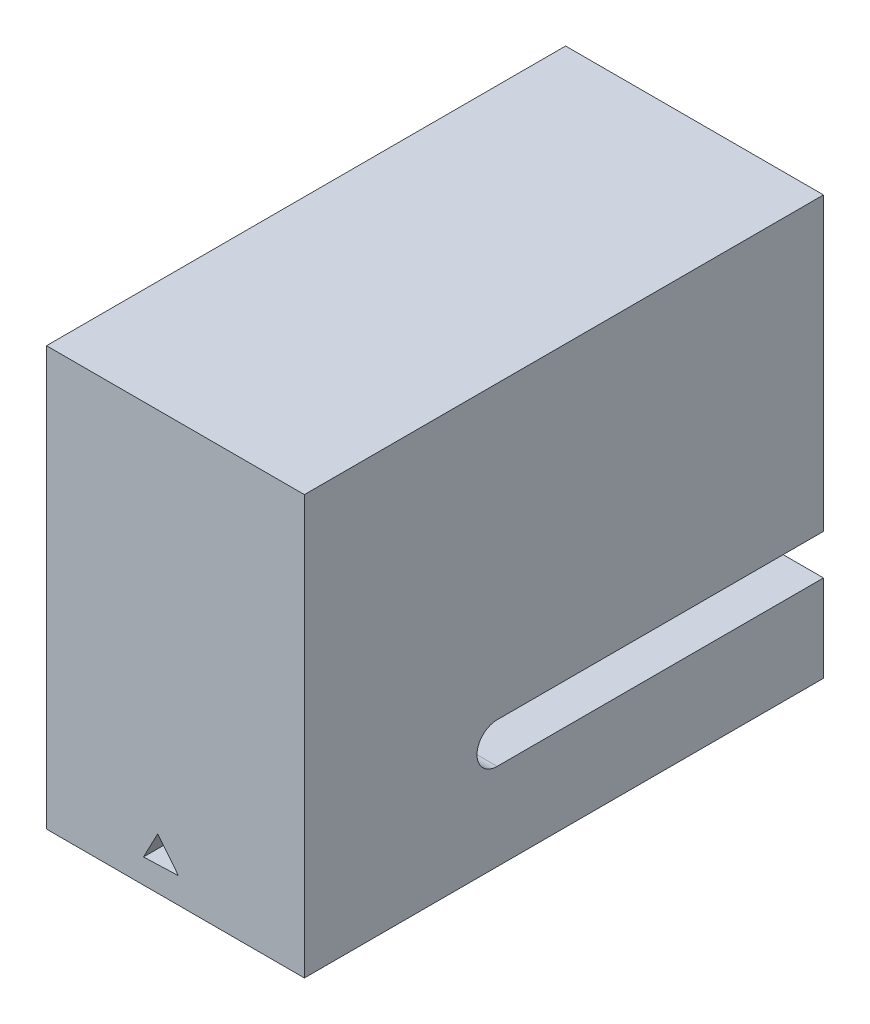
ISO-10303-21;
HEADER;
FILE_DESCRIPTION(('STEP AP214'),'2;1');
FILE_NAME('part.step','',(''),(''),'','','');
FILE_SCHEMA(('AUTOMOTIVE_DESIGN { 1 0 10303 214 1 1 1 1 }'));
ENDSEC;
DATA;
#1=APPLICATION_CONTEXT('core data for automotive mechanical design processes');
#2=APPLICATION_PROTOCOL_DEFINITION('international standard','automotive_design',2000,#1);
#3=PRODUCT_CONTEXT('',#1,'mechanical');
#4=PRODUCT('Part','Part','',(#3));
#5=PRODUCT_RELATED_PRODUCT_CATEGORY('part','',(#4));
#6=PRODUCT_DEFINITION_FORMATION('','',#4);
#7=PRODUCT_DEFINITION_CONTEXT('part definition',#1,'design');
#8=PRODUCT_DEFINITION('design','',#6,#7);
#9=PRODUCT_DEFINITION_SHAPE('','',#8);
#10=(LENGTH_UNIT() NAMED_UNIT(*) SI_UNIT(.MILLI.,.METRE.));
#11=(NAMED_UNIT(*) PLANE_ANGLE_UNIT() SI_UNIT($,.RADIAN.));
#12=(NAMED_UNIT(*) SI_UNIT($,.STERADIAN.) SOLID_ANGLE_UNIT());
#13=UNCERTAINTY_MEASURE_WITH_UNIT(LENGTH_MEASURE(1.E-05),#10,'distance_accuracy_value','');
#14=(GEOMETRIC_REPRESENTATION_CONTEXT(3) GLOBAL_UNCERTAINTY_ASSIGNED_CONTEXT((#13)) GLOBAL_UNIT_ASSIGNED_CONTEXT((#10,
#11,#12)) REPRESENTATION_CONTEXT('',''));
#15=CARTESIAN_POINT('',(0.,0.,0.));
#16=DIRECTION('',(0.,0.,1.));
#17=DIRECTION('',(1.,0.,0.));
#18=AXIS2_PLACEMENT_3D('',#15,#16,#17);
#19=CARTESIAN_POINT('',(0.,0.,0.));
#20=DIRECTION('',(0.,0.,1.));
#21=DIRECTION('',(1.,0.,0.));
#22=AXIS2_PLACEMENT_3D('',#19,#20,#21);
#23=PLANE('',#22);
#24=DIRECTION('',(0.463549599739793,0.886070972654605,0.));
#25=VECTOR('',#24,1.);
#26=CARTESIAN_POINT('',(12.950642546668,3.253694745465,0.));
#27=LINE('',#26,#25);
#28=CARTESIAN_POINT('',(12.950642546668,3.253694745465,0.));
#29=VERTEX_POINT('',#28);
#30=CARTESIAN_POINT('',(14.902719031226,6.985071733687,0.));
#31=VERTEX_POINT('',#30);
#32=EDGE_CURVE('E9',#29,#31,#27,.T.);
#33=ORIENTED_EDGE('',*,*,#32,.F.);
#34=DIRECTION('',(-0.999375523416613,-0.0353350137366763,0.));
#35=VECTOR('',#34,1.);
#36=CARTESIAN_POINT('',(17.619948476348,3.418787831398,0.));
#37=LINE('',#36,#35);
#38=CARTESIAN_POINT('',(17.781301141889,3.424492792666,0.));
#39=VERTEX_POINT('',#38);
#40=EDGE_CURVE('E364',#39,#29,#37,.T.);
#41=ORIENTED_EDGE('',*,*,#40,.F.);
#42=DIRECTION('',(0.62869786887579,-0.777649657410739,0.));
#43=VECTOR('',#42,1.);
#44=CARTESIAN_POINT('',(14.93788161533,6.941578391597,0.));
#45=LINE('',#44,#43);
#46=EDGE_CURVE('E228',#31,#39,#45,.T.);
#47=ORIENTED_EDGE('',*,*,#46,.F.);
#48=EDGE_LOOP('',(#33,#41,#47));
#49=FACE_BOUND('',#48,.T.);
#50=CARTESIAN_POINT('',(5.733123732353,23.306785491,0.));
#51=DIRECTION('',(0.,0.,-1.));
#52=DIRECTION('',(-1.,0.,0.));
#53=AXIS2_PLACEMENT_3D('',#50,#51,#52);
#54=CIRCLE('',#53,1.917016546578);
#55=CARTESIAN_POINT('',(3.816107185775,23.306785491,0.));
#56=VERTEX_POINT('',#55);
#57=EDGE_CURVE('E312',#56,#56,#54,.T.);
#58=ORIENTED_EDGE('',*,*,#57,.F.);
#59=EDGE_LOOP('',(#58));
#60=FACE_BOUND('',#59,.T.);
#61=CARTESIAN_POINT('',(17.704709703638,40.253983811882,0.));
#62=DIRECTION('',(0.,0.,-1.));
#63=DIRECTION('',(-1.,0.,0.));
#64=AXIS2_PLACEMENT_3D('',#61,#62,#63);
#65=CIRCLE('',#64,10.765620622642);
#66=CARTESIAN_POINT('',(28.47033032628,40.253983811882,0.));
#67=VERTEX_POINT('',#66);
#68=CARTESIAN_POINT('',(6.939089080996,40.253983811882,0.));
#69=VERTEX_POINT('',#68);
#70=EDGE_CURVE('E299',#67,#69,#65,.T.);
#71=ORIENTED_EDGE('',*,*,#70,.F.);
#72=DIRECTION('',(0.,-1.,0.));
#73=VECTOR('',#72,1.);
#74=CARTESIAN_POINT('',(28.47033032628,42.092468070347,0.));
#75=LINE('',#74,#73);
#76=CARTESIAN_POINT('',(28.47033032628,42.092468070347,0.));
#77=VERTEX_POINT('',#76);
#78=EDGE_CURVE('E286',#77,#67,#75,.T.);
#79=ORIENTED_EDGE('',*,*,#78,.F.);
#80=CARTESIAN_POINT('',(17.704709703638,42.092468070347,0.));
#81=DIRECTION('',(0.,0.,-1.));
#82=DIRECTION('',(-1.,0.,0.));
#83=AXIS2_PLACEMENT_3D('',#80,#81,#82);
#84=CIRCLE('',#83,10.765620622642);
#85=CARTESIAN_POINT('',(6.939089080996,42.092468070347,0.));
#86=VERTEX_POINT('',#85);
#87=EDGE_CURVE('E282',#86,#77,#84,.T.);
#88=ORIENTED_EDGE('',*,*,#87,.F.);
#89=DIRECTION('',(0.,1.,0.));
#90=VECTOR('',#89,1.);
#91=CARTESIAN_POINT('',(6.939089080996,40.253983811882,0.));
#92=LINE('',#91,#90);
#93=EDGE_CURVE('E298',#69,#86,#92,.T.);
#94=ORIENTED_EDGE('',*,*,#93,.F.);
#95=EDGE_LOOP('',(#71,#79,#88,#94));
#96=FACE_BOUND('',#95,.T.);
#97=DIRECTION('',(0.,1.,0.));
#98=VECTOR('',#97,1.);
#99=CARTESIAN_POINT('',(34.428750430687,0.,0.));
#100=LINE('',#99,#98);
#101=CARTESIAN_POINT('',(34.428750430687,16.986584154754,0.));
#102=VERTEX_POINT('',#101);
#103=CARTESIAN_POINT('',(34.428750430687,55.88417687439,0.));
#104=VERTEX_POINT('',#103);
#105=EDGE_CURVE('E290',#102,#104,#100,.T.);
#106=ORIENTED_EDGE('',*,*,#105,.F.);
#107=DIRECTION('',(-1.,0.,0.));
#108=VECTOR('',#107,1.);
#109=CARTESIAN_POINT('',(34.428750430687,16.986584154754,0.));
#110=LINE('',#109,#108);
#111=CARTESIAN_POINT('',(2.431232507017,16.986584154754,0.));
#112=VERTEX_POINT('',#111);
#113=EDGE_CURVE('E345',#102,#112,#110,.T.);
#114=ORIENTED_EDGE('',*,*,#113,.T.);
#115=DIRECTION('',(0.,1.,0.));
#116=VECTOR('',#115,1.);
#117=CARTESIAN_POINT('',(2.431232507017,11.602100128615,0.));
#118=LINE('',#117,#116);
#119=CARTESIAN_POINT('',(2.431232507017,11.602100128615,0.));
#120=VERTEX_POINT('',#119);
#121=EDGE_CURVE('E268',#120,#112,#118,.T.);
#122=ORIENTED_EDGE('',*,*,#121,.F.);
#123=DIRECTION('',(-1.,0.,0.));
#124=VECTOR('',#123,1.);
#125=CARTESIAN_POINT('',(34.428750430687,11.602100128615,0.));
#126=LINE('',#125,#124);
#127=CARTESIAN_POINT('',(34.428750430687,11.602100128615,0.));
#128=VERTEX_POINT('',#127);
#129=EDGE_CURVE('E269',#128,#120,#126,.T.);
#130=ORIENTED_EDGE('',*,*,#129,.F.);
#131=DIRECTION('',(0.,1.,0.));
#132=VECTOR('',#131,1.);
#133=CARTESIAN_POINT('',(34.428750430687,0.,0.));
#134=LINE('',#133,#132);
#135=CARTESIAN_POINT('',(34.428750430687,0.,0.));
#136=VERTEX_POINT('',#135);
#137=EDGE_CURVE('E287',#136,#128,#134,.T.);
#138=ORIENTED_EDGE('',*,*,#137,.F.);
#139=DIRECTION('',(1.,0.,0.));
#140=VECTOR('',#139,1.);
#141=CARTESIAN_POINT('',(0.,0.,0.));
#142=LINE('',#141,#140);
#143=CARTESIAN_POINT('',(0.,0.,0.));
#144=VERTEX_POINT('',#143);
#145=EDGE_CURVE('E338',#144,#136,#142,.T.);
#146=ORIENTED_EDGE('',*,*,#145,.F.);
#147=DIRECTION('',(0.,1.,0.));
#148=VECTOR('',#147,1.);
#149=CARTESIAN_POINT('',(0.,0.,0.));
#150=LINE('',#149,#148);
#151=CARTESIAN_POINT('',(0.,55.88417687439,0.));
#152=VERTEX_POINT('',#151);
#153=EDGE_CURVE('E291',#144,#152,#150,.T.);
#154=ORIENTED_EDGE('',*,*,#153,.T.);
#155=DIRECTION('',(1.,0.,0.));
#156=VECTOR('',#155,1.);
#157=CARTESIAN_POINT('',(0.,55.88417687439,0.));
#158=LINE('',#157,#156);
#159=EDGE_CURVE('E356',#152,#104,#158,.T.);
#160=ORIENTED_EDGE('',*,*,#159,.T.);
#161=EDGE_LOOP('',(#106,#114,#122,#130,#138,#146,#154,#160));
#162=FACE_BOUND('',#161,.T.);
#163=ADVANCED_FACE('F15',(#49,#60,#96,#162),#23,.F.);
#164=CARTESIAN_POINT('',(12.950642546668,3.253694745465,0.));
#165=DIRECTION('',(-0.886070972654605,0.463549599739793,0.));
#166=DIRECTION('',(0.,0.,1.));
#167=AXIS2_PLACEMENT_3D('',#164,#165,#166);
#168=PLANE('',#167);
#169=DIRECTION('',(0.463549599739793,0.886070972654605,0.));
#170=VECTOR('',#169,1.);
#171=CARTESIAN_POINT('',(12.950642546668,3.253694745465,69.297958036549));
#172=LINE('',#171,#170);
#173=CARTESIAN_POINT('',(12.950642546668,3.253694745465,69.297958036549));
#174=VERTEX_POINT('',#173);
#175=CARTESIAN_POINT('',(14.837516173704,6.860437046445,69.297958036549));
#176=VERTEX_POINT('',#175);
#177=EDGE_CURVE('E253',#174,#176,#172,.T.);
#178=ORIENTED_EDGE('',*,*,#177,.F.);
#179=DIRECTION('',(0.,0.,1.));
#180=VECTOR('',#179,1.);
#181=CARTESIAN_POINT('',(12.950642546668,3.253694745465,0.));
#182=LINE('',#181,#180);
#183=EDGE_CURVE('E371',#29,#174,#182,.T.);
#184=ORIENTED_EDGE('',*,*,#183,.F.);
#185=ORIENTED_EDGE('',*,*,#32,.T.);
#186=CARTESIAN_POINT('',(14.902719031226,6.985071733687,0.));
#187=CARTESIAN_POINT('',(14.864524081595,6.91206242424298,0.));
#188=CARTESIAN_POINT('',(14.8375161737038,6.86043704644537,0.0534594553201564));
#189=CARTESIAN_POINT('',(14.837516173704,6.860437046445,0.129062542071));
#190=(BOUNDED_CURVE() B_SPLINE_CURVE(3,(#186,#187,#188,#189),.UNSPECIFIED.,.F.,
.F.) B_SPLINE_CURVE_WITH_KNOTS((4,4),(4.71238898038469,6.28318530717959),
.UNSPECIFIED.) CURVE() GEOMETRIC_REPRESENTATION_ITEM() RATIONAL_B_SPLINE_CURVE((1.,
0.804737854124365,0.804737854124365,1.)) REPRESENTATION_ITEM(''));
#191=CARTESIAN_POINT('',(14.837516173704,6.860437046445,0.129062542071));
#192=VERTEX_POINT('',#191);
#193=EDGE_CURVE('E24',#31,#192,#190,.T.);
#194=ORIENTED_EDGE('',*,*,#193,.T.);
#195=DIRECTION('',(0.,0.,1.));
#196=VECTOR('',#195,1.);
#197=CARTESIAN_POINT('',(14.837516173704,6.860437046445,0.));
#198=LINE('',#197,#196);
#199=EDGE_CURVE('E278',#192,#176,#198,.T.);
#200=ORIENTED_EDGE('',*,*,#199,.T.);
#201=EDGE_LOOP('',(#178,#184,#185,#194,#200));
#202=FACE_BOUND('',#201,.T.);
#203=ADVANCED_FACE('F17',(#202),#168,.F.);
#204=CARTESIAN_POINT('',(14.93788161533,6.941578391597,0.129062542071));
#205=DIRECTION('',(0.62869786887579,-0.777649657410739,0.));
#206=DIRECTION('',(0.,0.,-1.));
#207=AXIS2_PLACEMENT_3D('',#204,#205,#206);
#208=CYLINDRICAL_SURFACE('',#207,0.129062542071);
#209=ORIENTED_EDGE('',*,*,#46,.T.);
#210=CARTESIAN_POINT('',(17.781301141889,3.424492792666,0.));
#211=CARTESIAN_POINT('',(17.6867829387404,3.42115090372799,0.));
#212=CARTESIAN_POINT('',(17.6199484763485,3.41878783139795,0.0534594553201563));
#213=CARTESIAN_POINT('',(17.619948476348,3.418787831398,0.129062542071));
#214=(BOUNDED_CURVE() B_SPLINE_CURVE(3,(#210,#211,#212,#213),.UNSPECIFIED.,.F.,
.F.) B_SPLINE_CURVE_WITH_KNOTS((4,4),(1.5707963267949,3.1415926535898),
.UNSPECIFIED.) CURVE() GEOMETRIC_REPRESENTATION_ITEM() RATIONAL_B_SPLINE_CURVE((1.,
0.804737854124365,0.804737854124365,1.)) REPRESENTATION_ITEM(''));
#215=CARTESIAN_POINT('',(17.619948476348,3.418787831398,0.129062542071));
#216=VERTEX_POINT('',#215);
#217=EDGE_CURVE('E359',#39,#216,#214,.T.);
#218=ORIENTED_EDGE('',*,*,#217,.T.);
#219=DIRECTION('',(0.62869786887579,-0.777649657410739,0.));
#220=VECTOR('',#219,1.);
#221=CARTESIAN_POINT('',(14.837516173704,6.860437046445,0.129062542071));
#222=LINE('',#221,#220);
#223=EDGE_CURVE('E254',#192,#216,#222,.T.);
#224=ORIENTED_EDGE('',*,*,#223,.F.);
#225=ORIENTED_EDGE('',*,*,#193,.F.);
#226=EDGE_LOOP('',(#209,#218,#224,#225));
#227=FACE_BOUND('',#226,.T.);
#228=ADVANCED_FACE('F377',(#227),#208,.T.);
#229=CARTESIAN_POINT('',(17.619948476348,3.418787831398,0.));
#230=DIRECTION('',(0.0353350137366763,-0.999375523416613,0.));
#231=DIRECTION('',(0.,0.,-1.));
#232=AXIS2_PLACEMENT_3D('',#229,#230,#231);
#233=PLANE('',#232);
#234=ORIENTED_EDGE('',*,*,#217,.F.);
#235=ORIENTED_EDGE('',*,*,#40,.T.);
#236=ORIENTED_EDGE('',*,*,#183,.T.);
#237=DIRECTION('',(-0.999375523416613,-0.0353350137366763,0.));
#238=VECTOR('',#237,1.);
#239=CARTESIAN_POINT('',(17.619948476348,3.418787831398,69.297958036549));
#240=LINE('',#239,#238);
#241=CARTESIAN_POINT('',(17.619948476348,3.418787831398,69.297958036549));
#242=VERTEX_POINT('',#241);
#243=EDGE_CURVE('E259',#242,#174,#240,.T.);
#244=ORIENTED_EDGE('',*,*,#243,.F.);
#245=DIRECTION('',(0.,0.,1.));
#246=VECTOR('',#245,1.);
#247=CARTESIAN_POINT('',(17.619948476348,3.418787831398,0.));
#248=LINE('',#247,#246);
#249=EDGE_CURVE('E258',#216,#242,#248,.T.);
#250=ORIENTED_EDGE('',*,*,#249,.F.);
#251=EDGE_LOOP('',(#234,#235,#236,#244,#250));
#252=FACE_BOUND('',#251,.T.);
#253=ADVANCED_FACE('F383',(#252),#233,.F.);
#254=CARTESIAN_POINT('',(0.,55.88417687439,0.));
#255=DIRECTION('',(0.,1.,0.));
#256=DIRECTION('',(1.,0.,0.));
#257=AXIS2_PLACEMENT_3D('',#254,#255,#256);
#258=PLANE('',#257);
#259=ORIENTED_EDGE('',*,*,#159,.F.);
#260=DIRECTION('',(0.,0.,1.));
#261=VECTOR('',#260,1.);
#262=CARTESIAN_POINT('',(0.,55.88417687439,0.));
#263=LINE('',#262,#261);
#264=CARTESIAN_POINT('',(0.,55.88417687439,69.297958036549));
#265=VERTEX_POINT('',#264);
#266=EDGE_CURVE('E322',#152,#265,#263,.T.);
#267=ORIENTED_EDGE('',*,*,#266,.T.);
#268=DIRECTION('',(1.,0.,0.));
#269=VECTOR('',#268,1.);
#270=CARTESIAN_POINT('',(0.,55.88417687439,69.297958036549));
#271=LINE('',#270,#269);
#272=CARTESIAN_POINT('',(34.428750430687,55.88417687439,69.297958036549));
#273=VERTEX_POINT('',#272);
#274=EDGE_CURVE('E218',#265,#273,#271,.T.);
#275=ORIENTED_EDGE('',*,*,#274,.T.);
#276=DIRECTION('',(0.,0.,1.));
#277=VECTOR('',#276,1.);
#278=CARTESIAN_POINT('',(34.428750430687,55.88417687439,0.));
#279=LINE('',#278,#277);
#280=EDGE_CURVE('E353',#104,#273,#279,.T.);
#281=ORIENTED_EDGE('',*,*,#280,.F.);
#282=EDGE_LOOP('',(#259,#267,#275,#281));
#283=FACE_BOUND('',#282,.T.);
#284=ADVANCED_FACE('F413',(#283),#258,.T.);
#285=CARTESIAN_POINT('',(34.428750430687,0.,0.));
#286=DIRECTION('',(1.,0.,0.));
#287=DIRECTION('',(0.,1.,0.));
#288=AXIS2_PLACEMENT_3D('',#285,#286,#287);
#289=PLANE('',#288);
#290=DIRECTION('',(0.,1.,0.));
#291=VECTOR('',#290,1.);
#292=CARTESIAN_POINT('',(34.428750430687,0.,69.297958036549));
#293=LINE('',#292,#291);
#294=CARTESIAN_POINT('',(34.428750430687,0.,69.297958036549));
#295=VERTEX_POINT('',#294);
#296=EDGE_CURVE('E214',#295,#273,#293,.T.);
#297=ORIENTED_EDGE('',*,*,#296,.F.);
#298=DIRECTION('',(0.,0.,1.));
#299=VECTOR('',#298,1.);
#300=CARTESIAN_POINT('',(34.428750430687,0.,0.));
#301=LINE('',#300,#299);
#302=EDGE_CURVE('E332',#136,#295,#301,.T.);
#303=ORIENTED_EDGE('',*,*,#302,.F.);
#304=ORIENTED_EDGE('',*,*,#137,.T.);
#305=DIRECTION('',(0.,0.,-1.));
#306=VECTOR('',#305,1.);
#307=CARTESIAN_POINT('',(34.428750430687,11.602100128615,43.565455210682));
#308=LINE('',#307,#306);
#309=CARTESIAN_POINT('',(34.428750430687,11.602100128615,43.565455210682));
#310=VERTEX_POINT('',#309);
#311=EDGE_CURVE('E315',#310,#128,#308,.T.);
#312=ORIENTED_EDGE('',*,*,#311,.F.);
#313=CARTESIAN_POINT('',(34.428750430687,14.294342141684,43.565455210682));
#314=DIRECTION('',(1.,0.,0.));
#315=DIRECTION('',(0.,0.,1.));
#316=AXIS2_PLACEMENT_3D('',#313,#314,#315);
#317=CIRCLE('',#316,2.692242013069);
#318=CARTESIAN_POINT('',(34.428750430687,16.986584154754,43.565455210682));
#319=VERTEX_POINT('',#318);
#320=EDGE_CURVE('E205',#319,#310,#317,.T.);
#321=ORIENTED_EDGE('',*,*,#320,.F.);
#322=DIRECTION('',(0.,0.,1.));
#323=VECTOR('',#322,1.);
#324=CARTESIAN_POINT('',(34.428750430687,16.986584154754,0.));
#325=LINE('',#324,#323);
#326=EDGE_CURVE('E342',#102,#319,#325,.T.);
#327=ORIENTED_EDGE('',*,*,#326,.F.);
#328=ORIENTED_EDGE('',*,*,#105,.T.);
#329=ORIENTED_EDGE('',*,*,#280,.T.);
#330=EDGE_LOOP('',(#297,#303,#304,#312,#321,#327,#328,#329));
#331=FACE_BOUND('',#330,.T.);
#332=ADVANCED_FACE('F409',(#331),#289,.T.);
#333=CARTESIAN_POINT('',(0.,0.,0.));
#334=DIRECTION('',(1.,0.,0.));
#335=DIRECTION('',(0.,1.,0.));
#336=AXIS2_PLACEMENT_3D('',#333,#334,#335);
#337=PLANE('',#336);
#338=DIRECTION('',(0.,1.,0.));
#339=VECTOR('',#338,1.);
#340=CARTESIAN_POINT('',(0.,0.,69.297958036549));
#341=LINE('',#340,#339);
#342=CARTESIAN_POINT('',(0.,0.,69.297958036549));
#343=VERTEX_POINT('',#342);
#344=EDGE_CURVE('E198',#343,#265,#341,.T.);
#345=ORIENTED_EDGE('',*,*,#344,.T.);
#346=ORIENTED_EDGE('',*,*,#266,.F.);
#347=ORIENTED_EDGE('',*,*,#153,.F.);
#348=DIRECTION('',(0.,0.,1.));
#349=VECTOR('',#348,1.);
#350=CARTESIAN_POINT('',(0.,0.,0.));
#351=LINE('',#350,#349);
#352=EDGE_CURVE('E335',#144,#343,#351,.T.);
#353=ORIENTED_EDGE('',*,*,#352,.T.);
#354=EDGE_LOOP('',(#345,#346,#347,#353));
#355=FACE_BOUND('',#354,.T.);
#356=ADVANCED_FACE('F401',(#355),#337,.F.);
#357=CARTESIAN_POINT('',(34.428750430687,16.986584154754,0.));
#358=DIRECTION('',(0.,1.,0.));
#359=DIRECTION('',(1.,0.,0.));
#360=AXIS2_PLACEMENT_3D('',#357,#358,#359);
#361=PLANE('',#360);
#362=ORIENTED_EDGE('',*,*,#326,.T.);
#363=DIRECTION('',(-1.,0.,0.));
#364=VECTOR('',#363,1.);
#365=CARTESIAN_POINT('',(34.428750430687,16.986584154754,43.565455210682));
#366=LINE('',#365,#364);
#367=CARTESIAN_POINT('',(2.431232507017,16.986584154754,43.565455210682));
#368=VERTEX_POINT('',#367);
#369=EDGE_CURVE('E195',#319,#368,#366,.T.);
#370=ORIENTED_EDGE('',*,*,#369,.T.);
#371=DIRECTION('',(0.,0.,1.));
#372=VECTOR('',#371,1.);
#373=CARTESIAN_POINT('',(2.431232507017,16.986584154754,0.));
#374=LINE('',#373,#372);
#375=EDGE_CURVE('E329',#112,#368,#374,.T.);
#376=ORIENTED_EDGE('',*,*,#375,.F.);
#377=ORIENTED_EDGE('',*,*,#113,.F.);
#378=EDGE_LOOP('',(#362,#370,#376,#377));
#379=FACE_BOUND('',#378,.T.);
#380=ADVANCED_FACE('F425',(#379),#361,.F.);
#381=CARTESIAN_POINT('',(0.,0.,0.));
#382=DIRECTION('',(0.,1.,0.));
#383=DIRECTION('',(1.,0.,0.));
#384=AXIS2_PLACEMENT_3D('',#381,#382,#383);
#385=PLANE('',#384);
#386=ORIENTED_EDGE('',*,*,#302,.T.);
#387=DIRECTION('',(1.,0.,0.));
#388=VECTOR('',#387,1.);
#389=CARTESIAN_POINT('',(0.,0.,69.297958036549));
#390=LINE('',#389,#388);
#391=EDGE_CURVE('E219',#343,#295,#390,.T.);
#392=ORIENTED_EDGE('',*,*,#391,.F.);
#393=ORIENTED_EDGE('',*,*,#352,.F.);
#394=ORIENTED_EDGE('',*,*,#145,.T.);
#395=EDGE_LOOP('',(#386,#392,#393,#394));
#396=FACE_BOUND('',#395,.T.);
#397=ADVANCED_FACE('F405',(#396),#385,.F.);
#398=CARTESIAN_POINT('',(2.431232507017,14.294342141684,22.490522288247));
#399=DIRECTION('',(1.,0.,0.));
#400=DIRECTION('',(0.,-1.,0.));
#401=AXIS2_PLACEMENT_3D('',#398,#399,#400);
#402=PLANE('',#401);
#403=ORIENTED_EDGE('',*,*,#121,.T.);
#404=ORIENTED_EDGE('',*,*,#375,.T.);
#405=CARTESIAN_POINT('',(2.431232507017,14.294342141684,43.565455210682));
#406=DIRECTION('',(1.,0.,0.));
#407=DIRECTION('',(0.,0.,1.));
#408=AXIS2_PLACEMENT_3D('',#405,#406,#407);
#409=CIRCLE('',#408,2.692242013069);
#410=CARTESIAN_POINT('',(2.431232507017,11.602100128615,43.565455210682));
#411=VERTEX_POINT('',#410);
#412=EDGE_CURVE('E199',#368,#411,#409,.T.);
#413=ORIENTED_EDGE('',*,*,#412,.T.);
#414=DIRECTION('',(0.,0.,-1.));
#415=VECTOR('',#414,1.);
#416=CARTESIAN_POINT('',(2.431232507017,11.602100128615,43.565455210682));
#417=LINE('',#416,#415);
#418=EDGE_CURVE('E264',#411,#120,#417,.T.);
#419=ORIENTED_EDGE('',*,*,#418,.T.);
#420=EDGE_LOOP('',(#403,#404,#413,#419));
#421=FACE_BOUND('',#420,.T.);
#422=ADVANCED_FACE('F428',(#421),#402,.T.);
#423=CARTESIAN_POINT('',(34.428750430687,11.602100128615,43.565455210682));
#424=DIRECTION('',(0.,-1.,0.));
#425=DIRECTION('',(0.,0.,-1.));
#426=AXIS2_PLACEMENT_3D('',#423,#424,#425);
#427=PLANE('',#426);
#428=ORIENTED_EDGE('',*,*,#311,.T.);
#429=ORIENTED_EDGE('',*,*,#129,.T.);
#430=ORIENTED_EDGE('',*,*,#418,.F.);
#431=DIRECTION('',(-1.,0.,0.));
#432=VECTOR('',#431,1.);
#433=CARTESIAN_POINT('',(34.428750430687,11.602100128615,43.565455210682));
#434=LINE('',#433,#432);
#435=EDGE_CURVE('E201',#310,#411,#434,.T.);
#436=ORIENTED_EDGE('',*,*,#435,.F.);
#437=EDGE_LOOP('',(#428,#429,#430,#436));
#438=FACE_BOUND('',#437,.T.);
#439=ADVANCED_FACE('F419',(#438),#427,.F.);
#440=CARTESIAN_POINT('',(5.733123732353,23.306785491,0.));
#441=DIRECTION('',(0.,0.,-1.));
#442=DIRECTION('',(-1.,0.,0.));
#443=AXIS2_PLACEMENT_3D('',#440,#441,#442);
#444=CYLINDRICAL_SURFACE('',#443,1.917016546578);
#445=CARTESIAN_POINT('',(5.733123732353,23.306785491,54.420257158025));
#446=DIRECTION('',(0.,0.,-1.));
#447=DIRECTION('',(-1.,0.,0.));
#448=AXIS2_PLACEMENT_3D('',#445,#446,#447);
#449=CIRCLE('',#448,1.917016546578);
#450=CARTESIAN_POINT('',(3.816107185775,23.306785491,54.420257158025));
#451=VERTEX_POINT('',#450);
#452=EDGE_CURVE('E235',#451,#451,#449,.T.);
#453=ORIENTED_EDGE('',*,*,#452,.F.);
#454=EDGE_LOOP('',(#453));
#455=FACE_BOUND('',#454,.T.);
#456=ORIENTED_EDGE('',*,*,#57,.T.);
#457=EDGE_LOOP('',(#456));
#458=FACE_BOUND('',#457,.T.);
#459=ADVANCED_FACE('F436',(#455,#458),#444,.F.);
#460=CARTESIAN_POINT('',(6.939089080996,40.253983811882,0.));
#461=DIRECTION('',(-1.,0.,0.));
#462=DIRECTION('',(0.,0.,1.));
#463=AXIS2_PLACEMENT_3D('',#460,#461,#462);
#464=PLANE('',#463);
#465=ORIENTED_EDGE('',*,*,#93,.T.);
#466=DIRECTION('',(0.,0.,1.));
#467=VECTOR('',#466,1.);
#468=CARTESIAN_POINT('',(6.939089080996,42.092468070347,0.));
#469=LINE('',#468,#467);
#470=CARTESIAN_POINT('',(6.939089080996,42.092468070347,27.229436814974));
#471=VERTEX_POINT('',#470);
#472=EDGE_CURVE('E304',#86,#471,#469,.T.);
#473=ORIENTED_EDGE('',*,*,#472,.T.);
#474=DIRECTION('',(0.,1.,0.));
#475=VECTOR('',#474,1.);
#476=CARTESIAN_POINT('',(6.939089080996,40.253983811882,27.229436814974));
#477=LINE('',#476,#475);
#478=CARTESIAN_POINT('',(6.939089080996,40.253983811882,27.229436814974));
#479=VERTEX_POINT('',#478);
#480=EDGE_CURVE('E223',#479,#471,#477,.T.);
#481=ORIENTED_EDGE('',*,*,#480,.F.);
#482=DIRECTION('',(0.,0.,1.));
#483=VECTOR('',#482,1.);
#484=CARTESIAN_POINT('',(6.939089080996,40.253983811882,0.));
#485=LINE('',#484,#483);
#486=EDGE_CURVE('E295',#69,#479,#485,.T.);
#487=ORIENTED_EDGE('',*,*,#486,.F.);
#488=EDGE_LOOP('',(#465,#473,#481,#487));
#489=FACE_BOUND('',#488,.T.);
#490=ADVANCED_FACE('F454',(#489),#464,.F.);
#491=CARTESIAN_POINT('',(17.704709703638,40.253983811882,0.));
#492=DIRECTION('',(0.,0.,-1.));
#493=DIRECTION('',(-1.,0.,0.));
#494=AXIS2_PLACEMENT_3D('',#491,#492,#493);
#495=CYLINDRICAL_SURFACE('',#494,10.765620622642);
#496=ORIENTED_EDGE('',*,*,#70,.T.);
#497=ORIENTED_EDGE('',*,*,#486,.T.);
#498=CARTESIAN_POINT('',(17.704709703638,40.253983811882,27.229436814974));
#499=DIRECTION('',(0.,0.,-1.));
#500=DIRECTION('',(-1.,0.,0.));
#501=AXIS2_PLACEMENT_3D('',#498,#499,#500);
#502=CIRCLE('',#501,10.765620622642);
#503=CARTESIAN_POINT('',(28.47033032628,40.253983811882,27.229436814974));
#504=VERTEX_POINT('',#503);
#505=EDGE_CURVE('E213',#504,#479,#502,.T.);
#506=ORIENTED_EDGE('',*,*,#505,.F.);
#507=DIRECTION('',(0.,0.,1.));
#508=VECTOR('',#507,1.);
#509=CARTESIAN_POINT('',(28.47033032628,40.253983811882,0.));
#510=LINE('',#509,#508);
#511=EDGE_CURVE('E283',#67,#504,#510,.T.);
#512=ORIENTED_EDGE('',*,*,#511,.F.);
#513=EDGE_LOOP('',(#496,#497,#506,#512));
#514=FACE_BOUND('',#513,.T.);
#515=ADVANCED_FACE('F457',(#514),#495,.F.);
#516=CARTESIAN_POINT('',(17.704709703638,42.092468070347,0.));
#517=DIRECTION('',(0.,0.,-1.));
#518=DIRECTION('',(-1.,0.,0.));
#519=AXIS2_PLACEMENT_3D('',#516,#517,#518);
#520=CYLINDRICAL_SURFACE('',#519,10.765620622642);
#521=ORIENTED_EDGE('',*,*,#87,.T.);
#522=DIRECTION('',(0.,0.,1.));
#523=VECTOR('',#522,1.);
#524=CARTESIAN_POINT('',(28.47033032628,42.092468070347,0.));
#525=LINE('',#524,#523);
#526=CARTESIAN_POINT('',(28.47033032628,42.092468070347,27.229436814974));
#527=VERTEX_POINT('',#526);
#528=EDGE_CURVE('E279',#77,#527,#525,.T.);
#529=ORIENTED_EDGE('',*,*,#528,.T.);
#530=CARTESIAN_POINT('',(17.704709703638,42.092468070347,27.229436814974));
#531=DIRECTION('',(0.,0.,-1.));
#532=DIRECTION('',(-1.,0.,0.));
#533=AXIS2_PLACEMENT_3D('',#530,#531,#532);
#534=CIRCLE('',#533,10.765620622642);
#535=EDGE_CURVE('E192',#471,#527,#534,.T.);
#536=ORIENTED_EDGE('',*,*,#535,.F.);
#537=ORIENTED_EDGE('',*,*,#472,.F.);
#538=EDGE_LOOP('',(#521,#529,#536,#537));
#539=FACE_BOUND('',#538,.T.);
#540=ADVANCED_FACE('F452',(#539),#520,.F.);
#541=CARTESIAN_POINT('',(28.47033032628,42.092468070347,0.));
#542=DIRECTION('',(1.,0.,0.));
#543=DIRECTION('',(0.,1.,0.));
#544=AXIS2_PLACEMENT_3D('',#541,#542,#543);
#545=PLANE('',#544);
#546=ORIENTED_EDGE('',*,*,#78,.T.);
#547=ORIENTED_EDGE('',*,*,#511,.T.);
#548=DIRECTION('',(0.,-1.,0.));
#549=VECTOR('',#548,1.);
#550=CARTESIAN_POINT('',(28.47033032628,42.092468070347,27.229436814974));
#551=LINE('',#550,#549);
#552=EDGE_CURVE('E209',#527,#504,#551,.T.);
#553=ORIENTED_EDGE('',*,*,#552,.F.);
#554=ORIENTED_EDGE('',*,*,#528,.F.);
#555=EDGE_LOOP('',(#546,#547,#553,#554));
#556=FACE_BOUND('',#555,.T.);
#557=ADVANCED_FACE('F449',(#556),#545,.F.);
#558=CARTESIAN_POINT('',(14.837516173704,6.860437046445,0.));
#559=DIRECTION('',(0.777649657410739,0.62869786887579,0.));
#560=DIRECTION('',(0.,0.,-1.));
#561=AXIS2_PLACEMENT_3D('',#558,#559,#560);
#562=PLANE('',#561);
#563=ORIENTED_EDGE('',*,*,#223,.T.);
#564=ORIENTED_EDGE('',*,*,#249,.T.);
#565=DIRECTION('',(0.62869786887579,-0.777649657410739,0.));
#566=VECTOR('',#565,1.);
#567=CARTESIAN_POINT('',(14.837516173704,6.860437046445,69.297958036549));
#568=LINE('',#567,#566);
#569=EDGE_CURVE('E263',#176,#242,#568,.T.);
#570=ORIENTED_EDGE('',*,*,#569,.F.);
#571=ORIENTED_EDGE('',*,*,#199,.F.);
#572=EDGE_LOOP('',(#563,#564,#570,#571));
#573=FACE_BOUND('',#572,.T.);
#574=ADVANCED_FACE('F388',(#573),#562,.F.);
#575=CARTESIAN_POINT('',(0.,0.,69.297958036549));
#576=DIRECTION('',(0.,0.,1.));
#577=DIRECTION('',(1.,0.,0.));
#578=AXIS2_PLACEMENT_3D('',#575,#576,#577);
#579=PLANE('',#578);
#580=ORIENTED_EDGE('',*,*,#177,.T.);
#581=ORIENTED_EDGE('',*,*,#569,.T.);
#582=ORIENTED_EDGE('',*,*,#243,.T.);
#583=EDGE_LOOP('',(#580,#581,#582));
#584=FACE_BOUND('',#583,.T.);
#585=ORIENTED_EDGE('',*,*,#344,.F.);
#586=ORIENTED_EDGE('',*,*,#391,.T.);
#587=ORIENTED_EDGE('',*,*,#296,.T.);
#588=ORIENTED_EDGE('',*,*,#274,.F.);
#589=EDGE_LOOP('',(#585,#586,#587,#588));
#590=FACE_BOUND('',#589,.T.);
#591=ADVANCED_FACE('F391',(#584,#590),#579,.T.);
#592=CARTESIAN_POINT('',(34.428750430687,14.294342141684,43.565455210682));
#593=DIRECTION('',(1.,0.,0.));
#594=DIRECTION('',(0.,0.,1.));
#595=AXIS2_PLACEMENT_3D('',#592,#593,#594);
#596=CYLINDRICAL_SURFACE('',#595,2.692242013069);
#597=ORIENTED_EDGE('',*,*,#320,.T.);
#598=ORIENTED_EDGE('',*,*,#435,.T.);
#599=ORIENTED_EDGE('',*,*,#412,.F.);
#600=ORIENTED_EDGE('',*,*,#369,.F.);
#601=EDGE_LOOP('',(#597,#598,#599,#600));
#602=FACE_BOUND('',#601,.T.);
#603=ADVANCED_FACE('F394',(#602),#596,.F.);
#604=CARTESIAN_POINT('',(5.733123732353,23.306785491,54.420257158025));
#605=DIRECTION('',(0.,0.,-1.));
#606=DIRECTION('',(0.,-1.,0.));
#607=AXIS2_PLACEMENT_3D('',#604,#605,#606);
#608=PLANE('',#607);
#609=CARTESIAN_POINT('',(5.733123732353,23.306785491,54.420257158025));
#610=DIRECTION('',(0.,0.,1.));
#611=DIRECTION('',(1.,0.,0.));
#612=AXIS2_PLACEMENT_3D('',#609,#610,#611);
#613=CIRCLE('',#612,1.400105974964);
#614=CARTESIAN_POINT('',(7.133229707317,23.306785491,54.420257158025));
#615=VERTEX_POINT('',#614);
#616=EDGE_CURVE('E186',#615,#615,#613,.T.);
#617=ORIENTED_EDGE('',*,*,#616,.T.);
#618=EDGE_LOOP('',(#617));
#619=FACE_BOUND('',#618,.T.);
#620=ORIENTED_EDGE('',*,*,#452,.T.);
#621=EDGE_LOOP('',(#620));
#622=FACE_BOUND('',#621,.T.);
#623=ADVANCED_FACE('F482',(#619,#622),#608,.T.);
#624=CARTESIAN_POINT('',(17.704709703638,41.173225941115,27.229436814974));
#625=DIRECTION('',(0.,0.,-1.));
#626=DIRECTION('',(0.,-1.,0.));
#627=AXIS2_PLACEMENT_3D('',#624,#625,#626);
#628=PLANE('',#627);
#629=ORIENTED_EDGE('',*,*,#535,.T.);
#630=ORIENTED_EDGE('',*,*,#552,.T.);
#631=ORIENTED_EDGE('',*,*,#505,.T.);
#632=ORIENTED_EDGE('',*,*,#480,.T.);
#633=EDGE_LOOP('',(#629,#630,#631,#632));
#634=FACE_BOUND('',#633,.T.);
#635=ADVANCED_FACE('F480',(#634),#628,.T.);
#636=CARTESIAN_POINT('',(5.733123732353,23.306785491,0.));
#637=DIRECTION('',(0.,0.,-1.));
#638=DIRECTION('',(1.,0.,0.));
#639=AXIS2_PLACEMENT_3D('',#636,#637,#638);
#640=CYLINDRICAL_SURFACE('',#639,1.400105974964);
#641=ORIENTED_EDGE('',*,*,#616,.F.);
#642=EDGE_LOOP('',(#641));
#643=FACE_BOUND('',#642,.T.);
#644=CARTESIAN_POINT('',(5.733123732353,23.306785491,0.));
#645=DIRECTION('',(0.,0.,1.));
#646=DIRECTION('',(1.,0.,0.));
#647=AXIS2_PLACEMENT_3D('',#644,#645,#646);
#648=CIRCLE('',#647,1.400105974964);
#649=CARTESIAN_POINT('',(7.133229707317,23.306785491,0.));
#650=VERTEX_POINT('',#649);
#651=EDGE_CURVE('E182',#650,#650,#648,.T.);
#652=ORIENTED_EDGE('',*,*,#651,.T.);
#653=EDGE_LOOP('',(#652));
#654=FACE_BOUND('',#653,.T.);
#655=ADVANCED_FACE('F183',(#643,#654),#640,.T.);
#656=CARTESIAN_POINT('',(0.,0.,0.));
#657=DIRECTION('',(0.,0.,1.));
#658=DIRECTION('',(1.,0.,0.));
#659=AXIS2_PLACEMENT_3D('',#656,#657,#658);
#660=PLANE('',#659);
#661=ORIENTED_EDGE('',*,*,#651,.F.);
#662=EDGE_LOOP('',(#661));
#663=FACE_BOUND('',#662,.T.);
#664=ADVANCED_FACE('F488',(#663),#660,.F.);
#665=CLOSED_SHELL('',(#163,#203,#228,#253,#284,#332,#356,#380,#397,#422,#439,#459,#490,#515,
#540,#557,#574,#591,#603,#623,#635,#655,#664));
#666=MANIFOLD_SOLID_BREP('B1',#665);
#667=ADVANCED_BREP_SHAPE_REPRESENTATION('',(#18,#666),#14);
#668=SHAPE_DEFINITION_REPRESENTATION(#9,#667);
ENDSEC;
END-ISO-10303-21;
